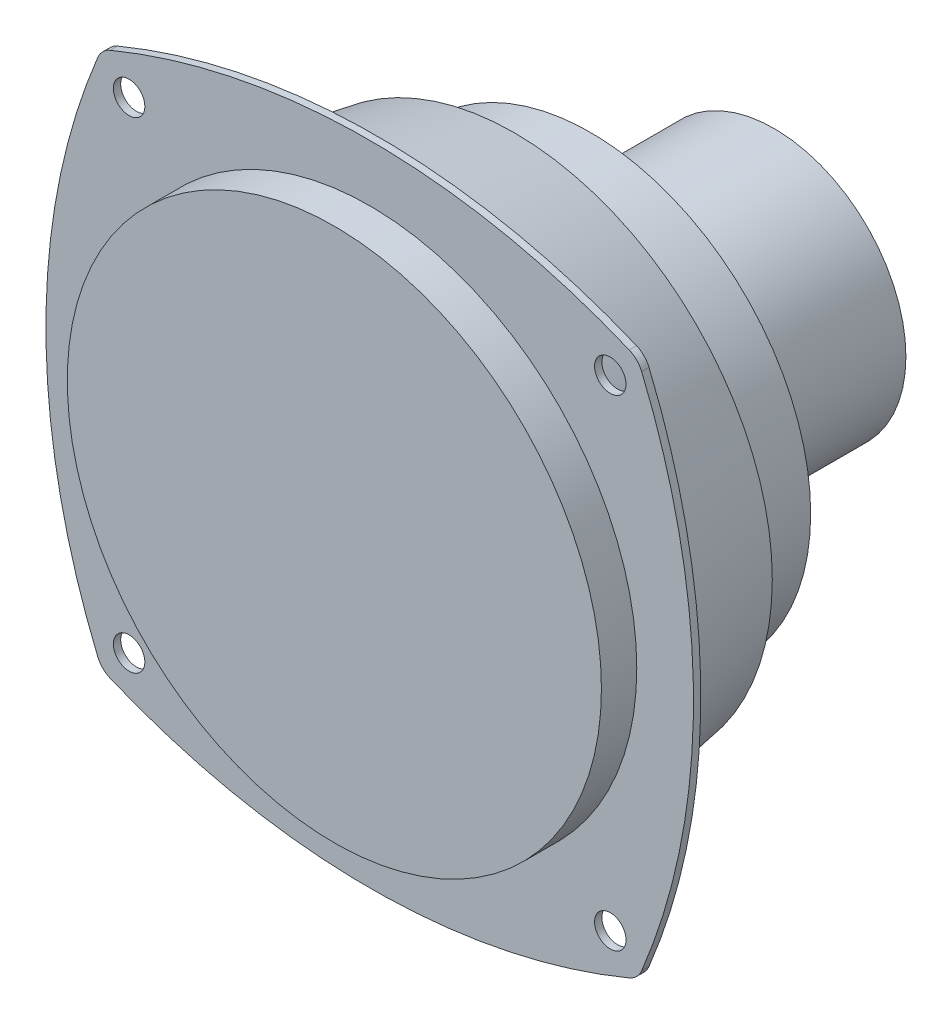
ISO-10303-21;
HEADER;
FILE_DESCRIPTION(('STEP AP214'),'2;1');
FILE_NAME('part.step','',(''),(''),'','','');
FILE_SCHEMA(('AUTOMOTIVE_DESIGN { 1 0 10303 214 1 1 1 1 }'));
ENDSEC;
DATA;
#1=APPLICATION_CONTEXT('core data for automotive mechanical design processes');
#2=APPLICATION_PROTOCOL_DEFINITION('international standard','automotive_design',2000,#1);
#3=PRODUCT_CONTEXT('',#1,'mechanical');
#4=PRODUCT('Part','Part','',(#3));
#5=PRODUCT_RELATED_PRODUCT_CATEGORY('part','',(#4));
#6=PRODUCT_DEFINITION_FORMATION('','',#4);
#7=PRODUCT_DEFINITION_CONTEXT('part definition',#1,'design');
#8=PRODUCT_DEFINITION('design','',#6,#7);
#9=PRODUCT_DEFINITION_SHAPE('','',#8);
#10=(LENGTH_UNIT() NAMED_UNIT(*) SI_UNIT(.MILLI.,.METRE.));
#11=(NAMED_UNIT(*) PLANE_ANGLE_UNIT() SI_UNIT($,.RADIAN.));
#12=(NAMED_UNIT(*) SI_UNIT($,.STERADIAN.) SOLID_ANGLE_UNIT());
#13=UNCERTAINTY_MEASURE_WITH_UNIT(LENGTH_MEASURE(1.E-05),#10,'distance_accuracy_value','');
#14=(GEOMETRIC_REPRESENTATION_CONTEXT(3) GLOBAL_UNCERTAINTY_ASSIGNED_CONTEXT((#13)) GLOBAL_UNIT_ASSIGNED_CONTEXT((#10,
#11,#12)) REPRESENTATION_CONTEXT('',''));
#15=CARTESIAN_POINT('',(0.,0.,0.));
#16=DIRECTION('',(0.,0.,1.));
#17=DIRECTION('',(1.,0.,0.));
#18=AXIS2_PLACEMENT_3D('',#15,#16,#17);
#19=CARTESIAN_POINT('',(0.,0.,-24.6));
#20=DIRECTION('',(0.,0.,1.));
#21=DIRECTION('',(1.,0.,0.));
#22=AXIS2_PLACEMENT_3D('',#19,#20,#21);
#23=CONICAL_SURFACE('',#22,35.25,0.168343554723202);
#24=CARTESIAN_POINT('',(0.,0.,-24.6));
#25=DIRECTION('',(0.,0.,1.));
#26=DIRECTION('',(1.,0.,0.));
#27=AXIS2_PLACEMENT_3D('',#24,#25,#26);
#28=CIRCLE('',#27,35.25);
#29=CARTESIAN_POINT('',(35.25,0.,-24.6));
#30=VERTEX_POINT('',#29);
#31=EDGE_CURVE('E289',#30,#30,#28,.T.);
#32=ORIENTED_EDGE('',*,*,#31,.T.);
#33=EDGE_LOOP('',(#32));
#34=FACE_BOUND('',#33,.T.);
#35=CARTESIAN_POINT('',(-15.5235468561056,-37.3499999999998,5.98235525157286));
#36=CARTESIAN_POINT('',(-15.2503462529446,-37.3499999999998,5.36558815334524));
#37=CARTESIAN_POINT('',(-14.972124426962,-37.3499999999998,4.75100106079624));
#38=CARTESIAN_POINT('',(-14.403805412816,-37.3499999999998,3.52709129327048));
#39=CARTESIAN_POINT('',(-14.1137041530564,-37.3499999999998,2.91777051142405));
#40=CARTESIAN_POINT('',(-13.516308900915,-37.3499999999998,1.69823177912345));
#41=CARTESIAN_POINT('',(-13.2088466674263,-37.3499999999998,1.08809590678744));
#42=CARTESIAN_POINT('',(-12.5777298922881,-37.3499999999998,-0.12365363799931));
#43=CARTESIAN_POINT('',(-12.2540777855418,-37.3499999999998,-0.725268574611103));
#44=CARTESIAN_POINT('',(-11.5721487939007,-37.3499999999998,-1.94529667180509));
#45=CARTESIAN_POINT('',(-11.2129634975808,-37.3499999999998,-2.56320536630982));
#46=CARTESIAN_POINT('',(-10.4688189886558,-37.3499999999998,-3.78373545523869));
#47=CARTESIAN_POINT('',(-10.0838491132485,-37.3499999999998,-4.38635038134488));
#48=CARTESIAN_POINT('',(-9.284148853347,-37.3499999999998,-5.56726897399857));
#49=CARTESIAN_POINT('',(-8.86958379500109,-37.3499999999998,-6.14568285089964));
#50=CARTESIAN_POINT('',(-8.21809589145369,-37.3499999999998,-6.99006991828984));
#51=CARTESIAN_POINT('',(-7.99608180825455,-37.3499999999998,-7.26756049878882));
#52=CARTESIAN_POINT('',(-7.54078221758439,-37.3499999999998,-7.81310433150241));
#53=CARTESIAN_POINT('',(-7.30749901257265,-37.3499999999998,-8.08115949233635));
#54=CARTESIAN_POINT('',(-6.88085209540887,-37.3499999999998,-8.54791475547698));
#55=CARTESIAN_POINT('',(-6.68999382384524,-37.3499999999998,-8.7489015625295));
#56=CARTESIAN_POINT('',(-6.29962537340333,-37.3499999999998,-9.14241648821872));
#57=CARTESIAN_POINT('',(-6.1001130189251,-37.3499999999998,-9.33494245505887));
#58=CARTESIAN_POINT('',(-5.69165163646688,-37.3499999999998,-9.70968434493123));
#59=CARTESIAN_POINT('',(-5.48270561895312,-37.3499999999998,-9.89190351582664));
#60=CARTESIAN_POINT('',(-5.05459925348257,-37.3499999999998,-10.2437578465474));
#61=CARTESIAN_POINT('',(-4.83543907617816,-37.3499999999998,-10.413393216493));
#62=CARTESIAN_POINT('',(-4.15338939096348,-37.3499999999998,-10.9050562948552));
#63=CARTESIAN_POINT('',(-3.67243927331983,-37.3499999999998,-11.2036329327324));
#64=CARTESIAN_POINT('',(-2.91651188014487,-37.3499999999998,-11.5794968545637));
#65=CARTESIAN_POINT('',(-2.6592396180917,-37.3499999999998,-11.6926566351789));
#66=CARTESIAN_POINT('',(-2.13406220631026,-37.3499999999998,-11.8905369980152));
#67=CARTESIAN_POINT('',(-1.8661653624615,-37.3499999999998,-11.9752793242347));
#68=CARTESIAN_POINT('',(-1.23772340576529,-37.3499999999998,-12.1328655366262));
#69=CARTESIAN_POINT('',(-0.874103489644981,-37.3499999999998,-12.1939640598733));
#70=CARTESIAN_POINT('',(-0.14168953552296,-37.3499999999998,-12.252547052158));
#71=CARTESIAN_POINT('',(0.227104235327452,-37.3499999999998,-12.250034793735));
#72=CARTESIAN_POINT('',(0.957963658914156,-37.3499999999998,-12.1818052793039));
#73=CARTESIAN_POINT('',(1.32004034124452,-37.3499999999998,-12.1162031352786));
#74=CARTESIAN_POINT('',(2.02923856635768,-37.3499999999998,-11.9293661259569));
#75=CARTESIAN_POINT('',(2.37635194312966,-37.3499999999998,-11.8081012936834));
#76=CARTESIAN_POINT('',(3.23170332980267,-37.3499999999998,-11.4434202815053));
#77=CARTESIAN_POINT('',(3.72682231815647,-37.3499999999998,-11.169361009193));
#78=CARTESIAN_POINT('',(4.43347693290436,-37.3499999999998,-10.7050565932076));
#79=CARTESIAN_POINT('',(4.66344971155165,-37.3499999999998,-10.5410360835303));
#80=CARTESIAN_POINT('',(5.11226981876912,-37.3499999999998,-10.1983419118858));
#81=CARTESIAN_POINT('',(5.33111870701025,-37.3499999999998,-10.0196703133661));
#82=CARTESIAN_POINT('',(5.80790496418261,-37.3499999999998,-9.6077211318686));
#83=CARTESIAN_POINT('',(6.06316904440405,-37.3499999999998,-9.37137481638139));
#84=CARTESIAN_POINT('',(6.55982768200348,-37.3499999999998,-8.88444925099785));
#85=CARTESIAN_POINT('',(6.80121703963284,-37.3499999999998,-8.63386473419568));
#86=CARTESIAN_POINT('',(7.27198134562937,-37.3499999999998,-8.12104313093173));
#87=CARTESIAN_POINT('',(7.50133839801556,-37.3499999999998,-7.85878970297194));
#88=CARTESIAN_POINT('',(7.94913436398128,-37.3499999999998,-7.3251110295253));
#89=CARTESIAN_POINT('',(8.16757204982306,-37.3499999999998,-7.05368475839885));
#90=CARTESIAN_POINT('',(8.59734115777907,-37.3499999999998,-6.50000869610199));
#91=CARTESIAN_POINT('',(8.80855467814404,-37.3499999999998,-6.21766770235995));
#92=CARTESIAN_POINT('',(9.22217660007314,-37.3499999999998,-5.64661709166166));
#93=CARTESIAN_POINT('',(9.42458478395215,-37.3499999999998,-5.35790731752234));
#94=CARTESIAN_POINT('',(9.82134145917095,-37.3499999999998,-4.77545013640787));
#95=CARTESIAN_POINT('',(10.0156980538797,-37.3499999999998,-4.48170823673739));
#96=CARTESIAN_POINT('',(10.3973718856423,-37.3499999999998,-3.88970989639038));
#97=CARTESIAN_POINT('',(10.5846892915042,-37.3499999999998,-3.59145356421608));
#98=CARTESIAN_POINT('',(11.1483451805988,-37.3499999999998,-2.67267946681172));
#99=CARTESIAN_POINT('',(11.5144513662635,-37.3499999999998,-2.04587135087793));
#100=CARTESIAN_POINT('',(12.224801821974,-37.3499999999998,-0.779936940443145));
#101=CARTESIAN_POINT('',(12.5690418187565,-37.3499999999998,-0.140808269779138));
#102=CARTESIAN_POINT('',(13.2394515720022,-37.3499999999998,1.14734669890425));
#103=CARTESIAN_POINT('',(13.5656096392183,-37.3499999999998,1.79637906142239));
#104=CARTESIAN_POINT('',(14.2024393823192,-37.3499999999998,3.10200415721866));
#105=CARTESIAN_POINT('',(14.5131103745399,-37.3499999999998,3.75859722268549));
#106=CARTESIAN_POINT('',(15.1223045392439,-37.3499999999998,5.08039897072367));
#107=CARTESIAN_POINT('',(15.4207771787562,-37.3499999999998,5.74563088269547));
#108=CARTESIAN_POINT('',(16.0060988155295,-37.3499999999998,7.08118872675436));
#109=CARTESIAN_POINT('',(16.2929476396943,-37.3499999999998,7.75151473452384));
#110=CARTESIAN_POINT('',(16.8563464767785,-37.3499999999998,9.09616873569007));
#111=CARTESIAN_POINT('',(17.1329004296426,-37.3499999999998,9.77049508115091));
#112=CARTESIAN_POINT('',(17.6770025470352,-37.3499999999998,11.1227753400679));
#113=CARTESIAN_POINT('',(17.9445505758563,-37.3499999999998,11.8007293080094));
#114=CARTESIAN_POINT('',(18.6797352513114,-37.3499999999998,13.6962790324301));
#115=CARTESIAN_POINT('',(19.1385559829667,-37.3499999999998,14.9172975045155));
#116=CARTESIAN_POINT('',(20.0350543171914,-37.3499999999998,17.3671812869839));
#117=CARTESIAN_POINT('',(20.4727296226317,-37.3499999999998,18.5960474335531));
#118=CARTESIAN_POINT('',(21.3267449263369,-37.3499999999998,21.0500007488422));
#119=CARTESIAN_POINT('',(21.7432290995711,-37.3499999999998,22.2750378165703));
#120=CARTESIAN_POINT('',(22.3566299003256,-37.3499999999998,24.1162213219027));
#121=CARTESIAN_POINT('',(22.5591908620544,-37.3499999999998,24.7304962498316));
#122=CARTESIAN_POINT('',(22.9608064764939,-37.3499999999998,25.9601860705966));
#123=CARTESIAN_POINT('',(23.1598611573671,-37.3499999999998,26.5756009542327));
#124=CARTESIAN_POINT('',(23.3572916756775,-37.3499999999998,27.1915372096555));
#125=B_SPLINE_CURVE_WITH_KNOTS('',3,(#35,#36,#37,#38,#39,#40,#41,#42,#43,#44,#45,#46,#47,#48,
#49,#50,#51,#52,#53,#54,#55,#56,#57,#58,#59,#60,#61,#62,#63,#64,#65,#66,#67,#68,#69,#70,#71,#72,
#73,#74,#75,#76,#77,#78,#79,#80,#81,#82,#83,#84,#85,#86,#87,#88,#89,#90,#91,#92,#93,#94,#95,#96,
#97,#98,#99,#100,#101,#102,#103,#104,#105,#106,#107,#108,#109,#110,#111,#112,#113,#114,#115,
#116,#117,#118,#119,#120,#121,#122,#123,#124),.UNSPECIFIED.,.F.,.F.,(4,2,2,2,2,2,2,2,2,2,2,2,2,
2,2,2,2,2,2,2,2,2,2,2,2,2,2,2,2,2,2,2,2,2,2,2,2,2,2,2,2,2,2,2,4),(0.,2.02373753890646,
4.04817460306917,6.09764534411171,8.14680877289671,10.2904548552482,12.4349929478268,
14.5683691587835,15.634259949395,16.6999338752917,17.531213542366,18.3627034147665,
19.1939297925279,20.0251422876061,21.7143939619996,22.5562393551849,23.3974391213381,
24.4982744975482,25.5990532399629,26.6978273362706,27.7971936717971,29.4845545708208,
30.3316429794413,31.1786122890519,32.2215687897329,33.2649136382959,34.3097686752665,
35.3547409292791,36.4123518235889,37.4699888492624,38.5265342086494,39.5830542146662,
41.7601187295818,43.9376074028994,46.1164877035862,48.2954641041051,50.4827033661722,
52.6699751875789,54.8564011282591,57.0428600007875,60.955729206456,64.8690225344548,
68.7505976186609,70.6910226276883,72.6314320440527),.UNSPECIFIED.);
#126=CARTESIAN_POINT('',(-9.08906485838968,-37.3499999999998,-5.83));
#127=VERTEX_POINT('',#126);
#128=CARTESIAN_POINT('',(9.08906485838968,-37.3499999999998,-5.83));
#129=VERTEX_POINT('',#128);
#130=EDGE_CURVE('E149',#127,#129,#125,.T.);
#131=ORIENTED_EDGE('',*,*,#130,.F.);
#132=CARTESIAN_POINT('',(0.,0.,-5.83));
#133=DIRECTION('',(0.,0.,1.));
#134=DIRECTION('',(1.,0.,0.));
#135=AXIS2_PLACEMENT_3D('',#132,#133,#134);
#136=CIRCLE('',#135,38.44);
#137=EDGE_CURVE('E292',#129,#127,#136,.T.);
#138=ORIENTED_EDGE('',*,*,#137,.F.);
#139=EDGE_LOOP('',(#131,#138));
#140=FACE_BOUND('',#139,.T.);
#141=ADVANCED_FACE('F32',(#34,#140),#23,.T.);
#142=CARTESIAN_POINT('',(0.,38.44,-5.83));
#143=DIRECTION('',(0.,0.,1.));
#144=DIRECTION('',(1.,0.,0.));
#145=AXIS2_PLACEMENT_3D('',#142,#143,#144);
#146=PLANE('',#145);
#147=CARTESIAN_POINT('',(-34.237226461577,34.2372264615774,-5.83));
#148=DIRECTION('',(0.,0.,1.));
#149=DIRECTION('',(1.,0.,0.));
#150=AXIS2_PLACEMENT_3D('',#147,#148,#149);
#151=CIRCLE('',#150,3.17499999999855);
#152=CARTESIAN_POINT('',(-37.1686586931178,35.4567878876131,-5.83));
#153=VERTEX_POINT('',#152);
#154=CARTESIAN_POINT('',(-35.4567878876127,37.1686586931182,-5.83));
#155=VERTEX_POINT('',#154);
#156=EDGE_CURVE('E251',#153,#155,#151,.F.);
#157=ORIENTED_EDGE('',*,*,#156,.T.);
#158=CARTESIAN_POINT('',(0.,-48.0580208505994,-5.83));
#159=DIRECTION('',(0.,0.,1.));
#160=DIRECTION('',(1.,0.,0.));
#161=AXIS2_PLACEMENT_3D('',#158,#159,#160);
#162=CIRCLE('',#161,92.3080208505994);
#163=CARTESIAN_POINT('',(35.4567878876127,37.1686586931182,-5.83));
#164=VERTEX_POINT('',#163);
#165=EDGE_CURVE('E346',#155,#164,#162,.F.);
#166=ORIENTED_EDGE('',*,*,#165,.T.);
#167=CARTESIAN_POINT('',(34.2372264615757,34.2372264615756,-5.83));
#168=DIRECTION('',(0.,0.,1.));
#169=DIRECTION('',(1.,0.,0.));
#170=AXIS2_PLACEMENT_3D('',#167,#168,#169);
#171=CIRCLE('',#170,3.17500000000068);
#172=CARTESIAN_POINT('',(37.1686586931183,35.4567878876126,-5.83));
#173=VERTEX_POINT('',#172);
#174=EDGE_CURVE('E348',#164,#173,#171,.F.);
#175=ORIENTED_EDGE('',*,*,#174,.T.);
#176=CARTESIAN_POINT('',(-48.0580208505994,1.60854789077695E-13,-5.83));
#177=DIRECTION('',(0.,0.,1.));
#178=DIRECTION('',(1.,0.,0.));
#179=AXIS2_PLACEMENT_3D('',#176,#177,#178);
#180=CIRCLE('',#179,92.3080208505994);
#181=CARTESIAN_POINT('',(37.1686586931181,-35.4567878876128,-5.83));
#182=VERTEX_POINT('',#181);
#183=EDGE_CURVE('E350',#173,#182,#180,.F.);
#184=ORIENTED_EDGE('',*,*,#183,.T.);
#185=CARTESIAN_POINT('',(34.2372264615757,-34.2372264615761,-5.83));
#186=DIRECTION('',(0.,0.,1.));
#187=DIRECTION('',(1.,0.,0.));
#188=AXIS2_PLACEMENT_3D('',#185,#186,#187);
#189=CIRCLE('',#188,3.17500000000034);
#190=CARTESIAN_POINT('',(35.4567878876124,-37.1686586931185,-5.83));
#191=VERTEX_POINT('',#190);
#192=EDGE_CURVE('E352',#182,#191,#189,.F.);
#193=ORIENTED_EDGE('',*,*,#192,.T.);
#194=CARTESIAN_POINT('',(3.28648472059297E-13,48.0580208505994,-5.83));
#195=DIRECTION('',(0.,0.,1.));
#196=DIRECTION('',(1.,0.,0.));
#197=AXIS2_PLACEMENT_3D('',#194,#195,#196);
#198=CIRCLE('',#197,92.3080208505994);
#199=CARTESIAN_POINT('',(-35.456787887613,-37.168658693118,-5.83));
#200=VERTEX_POINT('',#199);
#201=EDGE_CURVE('E355',#191,#200,#198,.F.);
#202=ORIENTED_EDGE('',*,*,#201,.T.);
#203=CARTESIAN_POINT('',(-34.2372264615768,-34.2372264615762,-5.83));
#204=DIRECTION('',(0.,0.,1.));
#205=DIRECTION('',(1.,0.,0.));
#206=AXIS2_PLACEMENT_3D('',#203,#204,#205);
#207=CIRCLE('',#206,3.17499999999957);
#208=CARTESIAN_POINT('',(-37.1686586931186,-35.4567878876123,-5.83));
#209=VERTEX_POINT('',#208);
#210=EDGE_CURVE('E326',#200,#209,#207,.F.);
#211=ORIENTED_EDGE('',*,*,#210,.T.);
#212=CARTESIAN_POINT('',(48.0580208505994,-4.96442155040899E-13,-5.83));
#213=DIRECTION('',(0.,0.,1.));
#214=DIRECTION('',(1.,0.,0.));
#215=AXIS2_PLACEMENT_3D('',#212,#213,#214);
#216=CIRCLE('',#215,92.3080208505994);
#217=EDGE_CURVE('E300',#209,#153,#216,.F.);
#218=ORIENTED_EDGE('',*,*,#217,.T.);
#219=EDGE_LOOP('',(#157,#166,#175,#184,#193,#202,#211,#218));
#220=FACE_BOUND('',#219,.T.);
#221=CARTESIAN_POINT('',(-32.8804653251745,-32.8804653251745,-5.83));
#222=DIRECTION('',(0.,0.,1.));
#223=DIRECTION('',(1.,0.,0.));
#224=AXIS2_PLACEMENT_3D('',#221,#222,#223);
#225=CIRCLE('',#224,2.14999999999999);
#226=CARTESIAN_POINT('',(-30.7304653251745,-32.8804653251745,-5.83));
#227=VERTEX_POINT('',#226);
#228=EDGE_CURVE('E256',#227,#227,#225,.T.);
#229=ORIENTED_EDGE('',*,*,#228,.T.);
#230=EDGE_LOOP('',(#229));
#231=FACE_BOUND('',#230,.T.);
#232=CARTESIAN_POINT('',(32.8804653251745,-32.8804653251745,-5.83));
#233=DIRECTION('',(0.,0.,1.));
#234=DIRECTION('',(1.,0.,0.));
#235=AXIS2_PLACEMENT_3D('',#232,#233,#234);
#236=CIRCLE('',#235,2.14999999999999);
#237=CARTESIAN_POINT('',(35.0304653251744,-32.8804653251745,-5.83));
#238=VERTEX_POINT('',#237);
#239=EDGE_CURVE('E260',#238,#238,#236,.T.);
#240=ORIENTED_EDGE('',*,*,#239,.T.);
#241=EDGE_LOOP('',(#240));
#242=FACE_BOUND('',#241,.T.);
#243=CARTESIAN_POINT('',(32.8804653251745,32.8804653251744,-5.83));
#244=DIRECTION('',(0.,0.,1.));
#245=DIRECTION('',(1.,0.,0.));
#246=AXIS2_PLACEMENT_3D('',#243,#244,#245);
#247=CIRCLE('',#246,2.14999999999999);
#248=CARTESIAN_POINT('',(35.0304653251745,32.8804653251744,-5.83));
#249=VERTEX_POINT('',#248);
#250=EDGE_CURVE('E264',#249,#249,#247,.T.);
#251=ORIENTED_EDGE('',*,*,#250,.T.);
#252=EDGE_LOOP('',(#251));
#253=FACE_BOUND('',#252,.T.);
#254=CARTESIAN_POINT('',(-32.8804653251745,32.8804653251744,-5.83));
#255=DIRECTION('',(0.,0.,1.));
#256=DIRECTION('',(1.,0.,0.));
#257=AXIS2_PLACEMENT_3D('',#254,#255,#256);
#258=CIRCLE('',#257,2.14999999999999);
#259=CARTESIAN_POINT('',(-30.7304653251745,32.8804653251744,-5.83));
#260=VERTEX_POINT('',#259);
#261=EDGE_CURVE('E267',#260,#260,#258,.T.);
#262=ORIENTED_EDGE('',*,*,#261,.T.);
#263=EDGE_LOOP('',(#262));
#264=FACE_BOUND('',#263,.T.);
#265=DIRECTION('',(1.,0.,0.));
#266=VECTOR('',#265,1.);
#267=CARTESIAN_POINT('',(14.085,-37.3499999999998,-5.83));
#268=LINE('',#267,#266);
#269=CARTESIAN_POINT('',(-14.085,-37.3499999999998,-5.83));
#270=VERTEX_POINT('',#269);
#271=EDGE_CURVE('E47',#270,#127,#268,.T.);
#272=ORIENTED_EDGE('',*,*,#271,.F.);
#273=DIRECTION('',(0.,1.,0.));
#274=VECTOR('',#273,1.);
#275=CARTESIAN_POINT('',(-14.085,-37.3499999999998,-5.83));
#276=LINE('',#275,#274);
#277=CARTESIAN_POINT('',(-14.085,-39.85,-5.83));
#278=VERTEX_POINT('',#277);
#279=EDGE_CURVE('E51',#278,#270,#276,.T.);
#280=ORIENTED_EDGE('',*,*,#279,.F.);
#281=DIRECTION('',(-1.,0.,0.));
#282=VECTOR('',#281,1.);
#283=CARTESIAN_POINT('',(14.085,-39.8499999999997,-5.83));
#284=LINE('',#283,#282);
#285=CARTESIAN_POINT('',(14.085,-39.8499999999997,-5.83));
#286=VERTEX_POINT('',#285);
#287=EDGE_CURVE('E398',#286,#278,#284,.T.);
#288=ORIENTED_EDGE('',*,*,#287,.F.);
#289=DIRECTION('',(0.,-1.,0.));
#290=VECTOR('',#289,1.);
#291=CARTESIAN_POINT('',(14.085,-37.3499999999998,-5.83));
#292=LINE('',#291,#290);
#293=CARTESIAN_POINT('',(14.085,-37.3499999999998,-5.83));
#294=VERTEX_POINT('',#293);
#295=EDGE_CURVE('E148',#294,#286,#292,.T.);
#296=ORIENTED_EDGE('',*,*,#295,.F.);
#297=DIRECTION('',(1.,0.,0.));
#298=VECTOR('',#297,1.);
#299=CARTESIAN_POINT('',(0.,-37.3499999999998,-5.83));
#300=LINE('',#299,#298);
#301=EDGE_CURVE('E11',#129,#294,#300,.T.);
#302=ORIENTED_EDGE('',*,*,#301,.F.);
#303=ORIENTED_EDGE('',*,*,#137,.T.);
#304=EDGE_LOOP('',(#272,#280,#288,#296,#302,#303));
#305=FACE_BOUND('',#304,.T.);
#306=ADVANCED_FACE('F240',(#220,#231,#242,#253,#264,#305),#146,.F.);
#307=CARTESIAN_POINT('',(0.,44.25,-4.83));
#308=DIRECTION('',(0.,0.,-1.));
#309=DIRECTION('',(-1.,0.,0.));
#310=AXIS2_PLACEMENT_3D('',#307,#308,#309);
#311=PLANE('',#310);
#312=CARTESIAN_POINT('',(-32.8804653251745,32.8804653251744,-4.83));
#313=DIRECTION('',(0.,0.,1.));
#314=DIRECTION('',(1.,0.,0.));
#315=AXIS2_PLACEMENT_3D('',#312,#313,#314);
#316=CIRCLE('',#315,2.14999999999999);
#317=CARTESIAN_POINT('',(-30.7304653251745,32.8804653251744,-4.83));
#318=VERTEX_POINT('',#317);
#319=EDGE_CURVE('E152',#318,#318,#316,.T.);
#320=ORIENTED_EDGE('',*,*,#319,.F.);
#321=EDGE_LOOP('',(#320));
#322=FACE_BOUND('',#321,.T.);
#323=CARTESIAN_POINT('',(32.8804653251745,-32.8804653251745,-4.83));
#324=DIRECTION('',(0.,0.,1.));
#325=DIRECTION('',(1.,0.,0.));
#326=AXIS2_PLACEMENT_3D('',#323,#324,#325);
#327=CIRCLE('',#326,2.14999999999999);
#328=CARTESIAN_POINT('',(35.0304653251744,-32.8804653251745,-4.83));
#329=VERTEX_POINT('',#328);
#330=EDGE_CURVE('E274',#329,#329,#327,.T.);
#331=ORIENTED_EDGE('',*,*,#330,.F.);
#332=EDGE_LOOP('',(#331));
#333=FACE_BOUND('',#332,.T.);
#334=CARTESIAN_POINT('',(-32.8804653251745,-32.8804653251745,-4.83));
#335=DIRECTION('',(0.,0.,1.));
#336=DIRECTION('',(1.,0.,0.));
#337=AXIS2_PLACEMENT_3D('',#334,#335,#336);
#338=CIRCLE('',#337,2.14999999999999);
#339=CARTESIAN_POINT('',(-30.7304653251745,-32.8804653251745,-4.83));
#340=VERTEX_POINT('',#339);
#341=EDGE_CURVE('E277',#340,#340,#338,.T.);
#342=ORIENTED_EDGE('',*,*,#341,.F.);
#343=EDGE_LOOP('',(#342));
#344=FACE_BOUND('',#343,.T.);
#345=CARTESIAN_POINT('',(0.,0.,-4.83));
#346=DIRECTION('',(0.,0.,1.));
#347=DIRECTION('',(1.,0.,0.));
#348=AXIS2_PLACEMENT_3D('',#345,#346,#347);
#349=CIRCLE('',#348,36.5);
#350=CARTESIAN_POINT('',(36.5,0.,-4.83));
#351=VERTEX_POINT('',#350);
#352=EDGE_CURVE('E294',#351,#351,#349,.T.);
#353=ORIENTED_EDGE('',*,*,#352,.F.);
#354=EDGE_LOOP('',(#353));
#355=FACE_BOUND('',#354,.T.);
#356=CARTESIAN_POINT('',(34.2372264615757,-34.2372264615761,-4.83));
#357=DIRECTION('',(0.,0.,1.));
#358=DIRECTION('',(1.,0.,0.));
#359=AXIS2_PLACEMENT_3D('',#356,#357,#358);
#360=CIRCLE('',#359,3.17500000000034);
#361=CARTESIAN_POINT('',(35.4567878876124,-37.1686586931185,-4.83));
#362=VERTEX_POINT('',#361);
#363=CARTESIAN_POINT('',(37.1686586931181,-35.4567878876128,-4.83));
#364=VERTEX_POINT('',#363);
#365=EDGE_CURVE('E333',#362,#364,#360,.T.);
#366=ORIENTED_EDGE('',*,*,#365,.T.);
#367=CARTESIAN_POINT('',(-48.0580208505994,1.60854789077695E-13,-4.83));
#368=DIRECTION('',(0.,0.,1.));
#369=DIRECTION('',(-1.,0.,0.));
#370=AXIS2_PLACEMENT_3D('',#367,#368,#369);
#371=CIRCLE('',#370,92.3080208505994);
#372=CARTESIAN_POINT('',(37.1686586931183,35.4567878876126,-4.83));
#373=VERTEX_POINT('',#372);
#374=EDGE_CURVE('E331',#364,#373,#371,.T.);
#375=ORIENTED_EDGE('',*,*,#374,.T.);
#376=CARTESIAN_POINT('',(34.2372264615757,34.2372264615756,-4.83));
#377=DIRECTION('',(0.,0.,1.));
#378=DIRECTION('',(-1.,0.,0.));
#379=AXIS2_PLACEMENT_3D('',#376,#377,#378);
#380=CIRCLE('',#379,3.17500000000068);
#381=CARTESIAN_POINT('',(35.4567878876127,37.1686586931182,-4.83));
#382=VERTEX_POINT('',#381);
#383=EDGE_CURVE('E328',#373,#382,#380,.T.);
#384=ORIENTED_EDGE('',*,*,#383,.T.);
#385=CARTESIAN_POINT('',(0.,-48.0580208505994,-4.83));
#386=DIRECTION('',(0.,0.,1.));
#387=DIRECTION('',(-1.,0.,0.));
#388=AXIS2_PLACEMENT_3D('',#385,#386,#387);
#389=CIRCLE('',#388,92.3080208505994);
#390=CARTESIAN_POINT('',(-35.4567878876127,37.1686586931182,-4.83));
#391=VERTEX_POINT('',#390);
#392=EDGE_CURVE('E305',#382,#391,#389,.T.);
#393=ORIENTED_EDGE('',*,*,#392,.T.);
#394=CARTESIAN_POINT('',(-34.237226461577,34.2372264615774,-4.83));
#395=DIRECTION('',(0.,0.,1.));
#396=DIRECTION('',(-1.,0.,0.));
#397=AXIS2_PLACEMENT_3D('',#394,#395,#396);
#398=CIRCLE('',#397,3.17499999999855);
#399=CARTESIAN_POINT('',(-37.1686586931178,35.4567878876131,-4.83));
#400=VERTEX_POINT('',#399);
#401=EDGE_CURVE('E276',#391,#400,#398,.T.);
#402=ORIENTED_EDGE('',*,*,#401,.T.);
#403=CARTESIAN_POINT('',(48.0580208505994,-4.96442155040899E-13,-4.83));
#404=DIRECTION('',(0.,0.,1.));
#405=DIRECTION('',(-1.,0.,0.));
#406=AXIS2_PLACEMENT_3D('',#403,#404,#405);
#407=CIRCLE('',#406,92.3080208505994);
#408=CARTESIAN_POINT('',(-37.1686586931186,-35.4567878876123,-4.83));
#409=VERTEX_POINT('',#408);
#410=EDGE_CURVE('E341',#400,#409,#407,.T.);
#411=ORIENTED_EDGE('',*,*,#410,.T.);
#412=CARTESIAN_POINT('',(-34.2372264615768,-34.2372264615762,-4.83));
#413=DIRECTION('',(0.,0.,1.));
#414=DIRECTION('',(1.,0.,0.));
#415=AXIS2_PLACEMENT_3D('',#412,#413,#414);
#416=CIRCLE('',#415,3.17499999999957);
#417=CARTESIAN_POINT('',(-35.456787887613,-37.168658693118,-4.83));
#418=VERTEX_POINT('',#417);
#419=EDGE_CURVE('E338',#409,#418,#416,.T.);
#420=ORIENTED_EDGE('',*,*,#419,.T.);
#421=CARTESIAN_POINT('',(3.28648472059297E-13,48.0580208505994,-4.83));
#422=DIRECTION('',(0.,0.,1.));
#423=DIRECTION('',(-1.,0.,0.));
#424=AXIS2_PLACEMENT_3D('',#421,#422,#423);
#425=CIRCLE('',#424,92.3080208505994);
#426=EDGE_CURVE('E336',#418,#362,#425,.T.);
#427=ORIENTED_EDGE('',*,*,#426,.T.);
#428=EDGE_LOOP('',(#366,#375,#384,#393,#402,#411,#420,#427));
#429=FACE_BOUND('',#428,.T.);
#430=CARTESIAN_POINT('',(32.8804653251745,32.8804653251744,-4.83));
#431=DIRECTION('',(0.,0.,1.));
#432=DIRECTION('',(1.,0.,0.));
#433=AXIS2_PLACEMENT_3D('',#430,#431,#432);
#434=CIRCLE('',#433,2.14999999999999);
#435=CARTESIAN_POINT('',(35.0304653251745,32.8804653251744,-4.83));
#436=VERTEX_POINT('',#435);
#437=EDGE_CURVE('E269',#436,#436,#434,.T.);
#438=ORIENTED_EDGE('',*,*,#437,.F.);
#439=EDGE_LOOP('',(#438));
#440=FACE_BOUND('',#439,.T.);
#441=ADVANCED_FACE('F238',(#322,#333,#344,#355,#429,#440),#311,.F.);
#442=CARTESIAN_POINT('',(0.,0.,-60.11));
#443=DIRECTION('',(0.,0.,1.));
#444=DIRECTION('',(1.,0.,0.));
#445=AXIS2_PLACEMENT_3D('',#442,#443,#444);
#446=PLANE('',#445);
#447=CARTESIAN_POINT('',(0.,0.,-60.11));
#448=DIRECTION('',(0.,0.,1.));
#449=DIRECTION('',(1.,0.,0.));
#450=AXIS2_PLACEMENT_3D('',#447,#448,#449);
#451=CIRCLE('',#450,18.);
#452=CARTESIAN_POINT('',(18.,0.,-60.11));
#453=VERTEX_POINT('',#452);
#454=EDGE_CURVE('E40',#453,#453,#451,.T.);
#455=ORIENTED_EDGE('',*,*,#454,.F.);
#456=EDGE_LOOP('',(#455));
#457=FACE_BOUND('',#456,.T.);
#458=ADVANCED_FACE('F34',(#457),#446,.F.);
#459=CARTESIAN_POINT('',(0.,0.,0.));
#460=DIRECTION('',(0.,0.,1.));
#461=DIRECTION('',(1.,0.,0.));
#462=AXIS2_PLACEMENT_3D('',#459,#460,#461);
#463=CYLINDRICAL_SURFACE('',#462,18.);
#464=CARTESIAN_POINT('',(0.,0.,-35.01));
#465=DIRECTION('',(0.,0.,1.));
#466=DIRECTION('',(1.,0.,0.));
#467=AXIS2_PLACEMENT_3D('',#464,#465,#466);
#468=CIRCLE('',#467,18.);
#469=CARTESIAN_POINT('',(18.,0.,-35.01));
#470=VERTEX_POINT('',#469);
#471=EDGE_CURVE('E280',#470,#470,#468,.T.);
#472=ORIENTED_EDGE('',*,*,#471,.F.);
#473=EDGE_LOOP('',(#472));
#474=FACE_BOUND('',#473,.T.);
#475=ORIENTED_EDGE('',*,*,#454,.T.);
#476=EDGE_LOOP('',(#475));
#477=FACE_BOUND('',#476,.T.);
#478=ADVANCED_FACE('F421',(#474,#477),#463,.T.);
#479=CARTESIAN_POINT('',(0.,18.,-35.01));
#480=DIRECTION('',(0.,0.,1.));
#481=DIRECTION('',(1.,0.,0.));
#482=AXIS2_PLACEMENT_3D('',#479,#480,#481);
#483=PLANE('',#482);
#484=CARTESIAN_POINT('',(0.,0.,-35.01));
#485=DIRECTION('',(0.,0.,1.));
#486=DIRECTION('',(1.,0.,0.));
#487=AXIS2_PLACEMENT_3D('',#484,#485,#486);
#488=CIRCLE('',#487,30.085);
#489=CARTESIAN_POINT('',(30.085,0.,-35.01));
#490=VERTEX_POINT('',#489);
#491=EDGE_CURVE('E283',#490,#490,#488,.T.);
#492=ORIENTED_EDGE('',*,*,#491,.F.);
#493=EDGE_LOOP('',(#492));
#494=FACE_BOUND('',#493,.T.);
#495=ORIENTED_EDGE('',*,*,#471,.T.);
#496=EDGE_LOOP('',(#495));
#497=FACE_BOUND('',#496,.T.);
#498=ADVANCED_FACE('F415',(#494,#497),#483,.F.);
#499=CARTESIAN_POINT('',(0.,0.,0.));
#500=DIRECTION('',(0.,0.,1.));
#501=DIRECTION('',(1.,0.,0.));
#502=AXIS2_PLACEMENT_3D('',#499,#500,#501);
#503=CYLINDRICAL_SURFACE('',#502,30.085);
#504=CARTESIAN_POINT('',(0.,0.,-24.6));
#505=DIRECTION('',(0.,0.,1.));
#506=DIRECTION('',(1.,0.,0.));
#507=AXIS2_PLACEMENT_3D('',#504,#505,#506);
#508=CIRCLE('',#507,30.085);
#509=CARTESIAN_POINT('',(30.085,0.,-24.6));
#510=VERTEX_POINT('',#509);
#511=EDGE_CURVE('E286',#510,#510,#508,.T.);
#512=ORIENTED_EDGE('',*,*,#511,.F.);
#513=EDGE_LOOP('',(#512));
#514=FACE_BOUND('',#513,.T.);
#515=ORIENTED_EDGE('',*,*,#491,.T.);
#516=EDGE_LOOP('',(#515));
#517=FACE_BOUND('',#516,.T.);
#518=ADVANCED_FACE('F410',(#514,#517),#503,.T.);
#519=CARTESIAN_POINT('',(0.,30.085,-24.6));
#520=DIRECTION('',(0.,0.,1.));
#521=DIRECTION('',(1.,0.,0.));
#522=AXIS2_PLACEMENT_3D('',#519,#520,#521);
#523=PLANE('',#522);
#524=ORIENTED_EDGE('',*,*,#31,.F.);
#525=EDGE_LOOP('',(#524));
#526=FACE_BOUND('',#525,.T.);
#527=ORIENTED_EDGE('',*,*,#511,.T.);
#528=EDGE_LOOP('',(#527));
#529=FACE_BOUND('',#528,.T.);
#530=ADVANCED_FACE('F202',(#526,#529),#523,.F.);
#531=CARTESIAN_POINT('',(0.,-48.0580208505994,-130.987900270019));
#532=DIRECTION('',(0.,0.,1.));
#533=DIRECTION('',(1.,0.,0.));
#534=AXIS2_PLACEMENT_3D('',#531,#532,#533);
#535=CYLINDRICAL_SURFACE('',#534,92.3080208505994);
#536=ORIENTED_EDGE('',*,*,#392,.F.);
#537=DIRECTION('',(0.,0.,1.));
#538=VECTOR('',#537,1.);
#539=CARTESIAN_POINT('',(35.4567878876127,37.1686586931182,-130.987900270019));
#540=LINE('',#539,#538);
#541=EDGE_CURVE('E320',#164,#382,#540,.T.);
#542=ORIENTED_EDGE('',*,*,#541,.F.);
#543=ORIENTED_EDGE('',*,*,#165,.F.);
#544=DIRECTION('',(0.,0.,1.));
#545=VECTOR('',#544,1.);
#546=CARTESIAN_POINT('',(-35.4567878876127,37.1686586931182,-130.987900270019));
#547=LINE('',#546,#545);
#548=EDGE_CURVE('E323',#155,#391,#547,.T.);
#549=ORIENTED_EDGE('',*,*,#548,.T.);
#550=EDGE_LOOP('',(#536,#542,#543,#549));
#551=FACE_BOUND('',#550,.T.);
#552=ADVANCED_FACE('F198',(#551),#535,.T.);
#553=CARTESIAN_POINT('',(-48.0580208505994,1.60854789077695E-13,-130.987900270019));
#554=DIRECTION('',(0.,0.,1.));
#555=DIRECTION('',(1.,0.,0.));
#556=AXIS2_PLACEMENT_3D('',#553,#554,#555);
#557=CYLINDRICAL_SURFACE('',#556,92.3080208505994);
#558=ORIENTED_EDGE('',*,*,#374,.F.);
#559=DIRECTION('',(0.,0.,1.));
#560=VECTOR('',#559,1.);
#561=CARTESIAN_POINT('',(37.1686586931181,-35.4567878876128,-130.987900270019));
#562=LINE('',#561,#560);
#563=EDGE_CURVE('E314',#182,#364,#562,.T.);
#564=ORIENTED_EDGE('',*,*,#563,.F.);
#565=ORIENTED_EDGE('',*,*,#183,.F.);
#566=DIRECTION('',(0.,0.,1.));
#567=VECTOR('',#566,1.);
#568=CARTESIAN_POINT('',(37.1686586931183,35.4567878876126,-130.987900270019));
#569=LINE('',#568,#567);
#570=EDGE_CURVE('E317',#173,#373,#569,.T.);
#571=ORIENTED_EDGE('',*,*,#570,.T.);
#572=EDGE_LOOP('',(#558,#564,#565,#571));
#573=FACE_BOUND('',#572,.T.);
#574=ADVANCED_FACE('F201',(#573),#557,.T.);
#575=CARTESIAN_POINT('',(3.28648472059297E-13,48.0580208505994,-130.987900270019));
#576=DIRECTION('',(0.,0.,1.));
#577=DIRECTION('',(1.,0.,0.));
#578=AXIS2_PLACEMENT_3D('',#575,#576,#577);
#579=CYLINDRICAL_SURFACE('',#578,92.3080208505994);
#580=ORIENTED_EDGE('',*,*,#426,.F.);
#581=DIRECTION('',(0.,0.,1.));
#582=VECTOR('',#581,1.);
#583=CARTESIAN_POINT('',(-35.456787887613,-37.168658693118,-130.987900270019));
#584=LINE('',#583,#582);
#585=EDGE_CURVE('E308',#200,#418,#584,.T.);
#586=ORIENTED_EDGE('',*,*,#585,.F.);
#587=ORIENTED_EDGE('',*,*,#201,.F.);
#588=DIRECTION('',(0.,0.,1.));
#589=VECTOR('',#588,1.);
#590=CARTESIAN_POINT('',(35.4567878876124,-37.1686586931185,-130.987900270019));
#591=LINE('',#590,#589);
#592=EDGE_CURVE('E311',#191,#362,#591,.T.);
#593=ORIENTED_EDGE('',*,*,#592,.T.);
#594=EDGE_LOOP('',(#580,#586,#587,#593));
#595=FACE_BOUND('',#594,.T.);
#596=ADVANCED_FACE('F212',(#595),#579,.T.);
#597=CARTESIAN_POINT('',(48.0580208505994,-4.96442155040899E-13,-130.987900270019));
#598=DIRECTION('',(0.,0.,1.));
#599=DIRECTION('',(1.,0.,0.));
#600=AXIS2_PLACEMENT_3D('',#597,#598,#599);
#601=CYLINDRICAL_SURFACE('',#600,92.3080208505994);
#602=DIRECTION('',(0.,0.,1.));
#603=VECTOR('',#602,1.);
#604=CARTESIAN_POINT('',(-37.1686586931186,-35.4567878876123,-130.987900270019));
#605=LINE('',#604,#603);
#606=EDGE_CURVE('E304',#209,#409,#605,.T.);
#607=ORIENTED_EDGE('',*,*,#606,.T.);
#608=ORIENTED_EDGE('',*,*,#410,.F.);
#609=DIRECTION('',(0.,0.,1.));
#610=VECTOR('',#609,1.);
#611=CARTESIAN_POINT('',(-37.1686586931178,35.4567878876131,-130.987900270019));
#612=LINE('',#611,#610);
#613=EDGE_CURVE('E302',#153,#400,#612,.T.);
#614=ORIENTED_EDGE('',*,*,#613,.F.);
#615=ORIENTED_EDGE('',*,*,#217,.F.);
#616=EDGE_LOOP('',(#607,#608,#614,#615));
#617=FACE_BOUND('',#616,.T.);
#618=ADVANCED_FACE('F220',(#617),#601,.T.);
#619=CARTESIAN_POINT('',(-34.237226461577,34.2372264615774,-130.987900270019));
#620=DIRECTION('',(0.,0.,1.));
#621=DIRECTION('',(1.,0.,0.));
#622=AXIS2_PLACEMENT_3D('',#619,#620,#621);
#623=CYLINDRICAL_SURFACE('',#622,3.17499999999855);
#624=ORIENTED_EDGE('',*,*,#156,.F.);
#625=ORIENTED_EDGE('',*,*,#613,.T.);
#626=ORIENTED_EDGE('',*,*,#401,.F.);
#627=ORIENTED_EDGE('',*,*,#548,.F.);
#628=EDGE_LOOP('',(#624,#625,#626,#627));
#629=FACE_BOUND('',#628,.T.);
#630=ADVANCED_FACE('F208',(#629),#623,.T.);
#631=CARTESIAN_POINT('',(34.2372264615757,34.2372264615756,-130.987900270019));
#632=DIRECTION('',(0.,0.,1.));
#633=DIRECTION('',(1.,0.,0.));
#634=AXIS2_PLACEMENT_3D('',#631,#632,#633);
#635=CYLINDRICAL_SURFACE('',#634,3.17500000000068);
#636=ORIENTED_EDGE('',*,*,#174,.F.);
#637=ORIENTED_EDGE('',*,*,#541,.T.);
#638=ORIENTED_EDGE('',*,*,#383,.F.);
#639=ORIENTED_EDGE('',*,*,#570,.F.);
#640=EDGE_LOOP('',(#636,#637,#638,#639));
#641=FACE_BOUND('',#640,.T.);
#642=ADVANCED_FACE('F204',(#641),#635,.T.);
#643=CARTESIAN_POINT('',(34.2372264615757,-34.2372264615761,-130.987900270019));
#644=DIRECTION('',(0.,0.,1.));
#645=DIRECTION('',(1.,0.,0.));
#646=AXIS2_PLACEMENT_3D('',#643,#644,#645);
#647=CYLINDRICAL_SURFACE('',#646,3.17500000000034);
#648=ORIENTED_EDGE('',*,*,#192,.F.);
#649=ORIENTED_EDGE('',*,*,#563,.T.);
#650=ORIENTED_EDGE('',*,*,#365,.F.);
#651=ORIENTED_EDGE('',*,*,#592,.F.);
#652=EDGE_LOOP('',(#648,#649,#650,#651));
#653=FACE_BOUND('',#652,.T.);
#654=ADVANCED_FACE('F207',(#653),#647,.T.);
#655=CARTESIAN_POINT('',(-34.2372264615768,-34.2372264615762,-130.987900270019));
#656=DIRECTION('',(0.,0.,1.));
#657=DIRECTION('',(1.,0.,0.));
#658=AXIS2_PLACEMENT_3D('',#655,#656,#657);
#659=CYLINDRICAL_SURFACE('',#658,3.17499999999957);
#660=ORIENTED_EDGE('',*,*,#210,.F.);
#661=ORIENTED_EDGE('',*,*,#585,.T.);
#662=ORIENTED_EDGE('',*,*,#419,.F.);
#663=ORIENTED_EDGE('',*,*,#606,.F.);
#664=EDGE_LOOP('',(#660,#661,#662,#663));
#665=FACE_BOUND('',#664,.T.);
#666=ADVANCED_FACE('F216',(#665),#659,.T.);
#667=CARTESIAN_POINT('',(0.,36.5,0.));
#668=DIRECTION('',(0.,0.,-1.));
#669=DIRECTION('',(-1.,0.,0.));
#670=AXIS2_PLACEMENT_3D('',#667,#668,#669);
#671=PLANE('',#670);
#672=CARTESIAN_POINT('',(0.,0.,0.));
#673=DIRECTION('',(0.,0.,1.));
#674=DIRECTION('',(1.,0.,0.));
#675=AXIS2_PLACEMENT_3D('',#672,#673,#674);
#676=CIRCLE('',#675,36.5);
#677=CARTESIAN_POINT('',(36.5,0.,0.));
#678=VERTEX_POINT('',#677);
#679=EDGE_CURVE('E297',#678,#678,#676,.T.);
#680=ORIENTED_EDGE('',*,*,#679,.T.);
#681=EDGE_LOOP('',(#680));
#682=FACE_BOUND('',#681,.T.);
#683=ADVANCED_FACE('F224',(#682),#671,.F.);
#684=CARTESIAN_POINT('',(0.,0.,0.));
#685=DIRECTION('',(0.,0.,1.));
#686=DIRECTION('',(1.,0.,0.));
#687=AXIS2_PLACEMENT_3D('',#684,#685,#686);
#688=CYLINDRICAL_SURFACE('',#687,36.5);
#689=ORIENTED_EDGE('',*,*,#679,.F.);
#690=EDGE_LOOP('',(#689));
#691=FACE_BOUND('',#690,.T.);
#692=ORIENTED_EDGE('',*,*,#352,.T.);
#693=EDGE_LOOP('',(#692));
#694=FACE_BOUND('',#693,.T.);
#695=ADVANCED_FACE('F196',(#691,#694),#688,.T.);
#696=CARTESIAN_POINT('',(-32.8804653251745,-32.8804653251745,-4.83));
#697=DIRECTION('',(0.,0.,1.));
#698=DIRECTION('',(1.,0.,0.));
#699=AXIS2_PLACEMENT_3D('',#696,#697,#698);
#700=CYLINDRICAL_SURFACE('',#699,2.14999999999999);
#701=ORIENTED_EDGE('',*,*,#341,.T.);
#702=EDGE_LOOP('',(#701));
#703=FACE_BOUND('',#702,.T.);
#704=ORIENTED_EDGE('',*,*,#228,.F.);
#705=EDGE_LOOP('',(#704));
#706=FACE_BOUND('',#705,.T.);
#707=ADVANCED_FACE('F192',(#703,#706),#700,.F.);
#708=CARTESIAN_POINT('',(32.8804653251745,-32.8804653251745,-4.83));
#709=DIRECTION('',(0.,0.,1.));
#710=DIRECTION('',(1.,0.,0.));
#711=AXIS2_PLACEMENT_3D('',#708,#709,#710);
#712=CYLINDRICAL_SURFACE('',#711,2.14999999999999);
#713=ORIENTED_EDGE('',*,*,#330,.T.);
#714=EDGE_LOOP('',(#713));
#715=FACE_BOUND('',#714,.T.);
#716=ORIENTED_EDGE('',*,*,#239,.F.);
#717=EDGE_LOOP('',(#716));
#718=FACE_BOUND('',#717,.T.);
#719=ADVANCED_FACE('F188',(#715,#718),#712,.F.);
#720=CARTESIAN_POINT('',(32.8804653251745,32.8804653251744,-4.83));
#721=DIRECTION('',(0.,0.,1.));
#722=DIRECTION('',(1.,0.,0.));
#723=AXIS2_PLACEMENT_3D('',#720,#721,#722);
#724=CYLINDRICAL_SURFACE('',#723,2.14999999999999);
#725=ORIENTED_EDGE('',*,*,#437,.T.);
#726=EDGE_LOOP('',(#725));
#727=FACE_BOUND('',#726,.T.);
#728=ORIENTED_EDGE('',*,*,#250,.F.);
#729=EDGE_LOOP('',(#728));
#730=FACE_BOUND('',#729,.T.);
#731=ADVANCED_FACE('F184',(#727,#730),#724,.F.);
#732=CARTESIAN_POINT('',(-32.8804653251745,32.8804653251744,-4.83));
#733=DIRECTION('',(0.,0.,1.));
#734=DIRECTION('',(1.,0.,0.));
#735=AXIS2_PLACEMENT_3D('',#732,#733,#734);
#736=CYLINDRICAL_SURFACE('',#735,2.14999999999999);
#737=ORIENTED_EDGE('',*,*,#319,.T.);
#738=EDGE_LOOP('',(#737));
#739=FACE_BOUND('',#738,.T.);
#740=ORIENTED_EDGE('',*,*,#261,.F.);
#741=EDGE_LOOP('',(#740));
#742=FACE_BOUND('',#741,.T.);
#743=ADVANCED_FACE('F172',(#739,#742),#736,.F.);
#744=CARTESIAN_POINT('',(14.085,-37.3499999999998,-29.36));
#745=DIRECTION('',(0.,-1.,0.));
#746=DIRECTION('',(0.,0.,-1.));
#747=AXIS2_PLACEMENT_3D('',#744,#745,#746);
#748=PLANE('',#747);
#749=ORIENTED_EDGE('',*,*,#271,.T.);
#750=ORIENTED_EDGE('',*,*,#130,.T.);
#751=ORIENTED_EDGE('',*,*,#301,.T.);
#752=DIRECTION('',(0.,0.,1.));
#753=VECTOR('',#752,1.);
#754=CARTESIAN_POINT('',(14.085,-37.3499999999998,-29.36));
#755=LINE('',#754,#753);
#756=CARTESIAN_POINT('',(14.085,-37.3499999999998,-29.36));
#757=VERTEX_POINT('',#756);
#758=EDGE_CURVE('E402',#757,#294,#755,.T.);
#759=ORIENTED_EDGE('',*,*,#758,.F.);
#760=DIRECTION('',(1.,0.,0.));
#761=VECTOR('',#760,1.);
#762=CARTESIAN_POINT('',(14.085,-37.3499999999998,-29.36));
#763=LINE('',#762,#761);
#764=CARTESIAN_POINT('',(-14.085,-37.3499999999998,-29.36));
#765=VERTEX_POINT('',#764);
#766=EDGE_CURVE('E142',#765,#757,#763,.T.);
#767=ORIENTED_EDGE('',*,*,#766,.F.);
#768=DIRECTION('',(0.,0.,1.));
#769=VECTOR('',#768,1.);
#770=CARTESIAN_POINT('',(-14.085,-37.3499999999998,-29.36));
#771=LINE('',#770,#769);
#772=EDGE_CURVE('E154',#765,#270,#771,.T.);
#773=ORIENTED_EDGE('',*,*,#772,.T.);
#774=EDGE_LOOP('',(#749,#750,#751,#759,#767,#773));
#775=FACE_BOUND('',#774,.T.);
#776=ADVANCED_FACE('F167',(#775),#748,.F.);
#777=CARTESIAN_POINT('',(14.085,-37.3499999999998,-29.36));
#778=DIRECTION('',(-1.,0.,0.));
#779=DIRECTION('',(0.,0.,1.));
#780=AXIS2_PLACEMENT_3D('',#777,#778,#779);
#781=PLANE('',#780);
#782=ORIENTED_EDGE('',*,*,#295,.T.);
#783=DIRECTION('',(0.,0.,1.));
#784=VECTOR('',#783,1.);
#785=CARTESIAN_POINT('',(14.085,-39.8499999999997,-29.36));
#786=LINE('',#785,#784);
#787=CARTESIAN_POINT('',(14.085,-39.8499999999997,-29.36));
#788=VERTEX_POINT('',#787);
#789=EDGE_CURVE('E130',#788,#286,#786,.T.);
#790=ORIENTED_EDGE('',*,*,#789,.F.);
#791=DIRECTION('',(0.,-1.,0.));
#792=VECTOR('',#791,1.);
#793=CARTESIAN_POINT('',(14.085,-37.3499999999998,-29.36));
#794=LINE('',#793,#792);
#795=EDGE_CURVE('E137',#757,#788,#794,.T.);
#796=ORIENTED_EDGE('',*,*,#795,.F.);
#797=ORIENTED_EDGE('',*,*,#758,.T.);
#798=EDGE_LOOP('',(#782,#790,#796,#797));
#799=FACE_BOUND('',#798,.T.);
#800=ADVANCED_FACE('F147',(#799),#781,.F.);
#801=CARTESIAN_POINT('',(14.085,-39.8499999999997,-29.36));
#802=DIRECTION('',(0.,1.,0.));
#803=DIRECTION('',(-1.,0.,0.));
#804=AXIS2_PLACEMENT_3D('',#801,#802,#803);
#805=PLANE('',#804);
#806=ORIENTED_EDGE('',*,*,#287,.T.);
#807=DIRECTION('',(0.,0.,1.));
#808=VECTOR('',#807,1.);
#809=CARTESIAN_POINT('',(-14.085,-39.85,-29.36));
#810=LINE('',#809,#808);
#811=CARTESIAN_POINT('',(-14.085,-39.85,-29.36));
#812=VERTEX_POINT('',#811);
#813=EDGE_CURVE('E133',#812,#278,#810,.T.);
#814=ORIENTED_EDGE('',*,*,#813,.F.);
#815=DIRECTION('',(-1.,0.,0.));
#816=VECTOR('',#815,1.);
#817=CARTESIAN_POINT('',(14.085,-39.8499999999997,-29.36));
#818=LINE('',#817,#816);
#819=EDGE_CURVE('E126',#788,#812,#818,.T.);
#820=ORIENTED_EDGE('',*,*,#819,.F.);
#821=ORIENTED_EDGE('',*,*,#789,.T.);
#822=EDGE_LOOP('',(#806,#814,#820,#821));
#823=FACE_BOUND('',#822,.T.);
#824=ADVANCED_FACE('F128',(#823),#805,.F.);
#825=CARTESIAN_POINT('',(-14.085,-37.3499999999998,-29.36));
#826=DIRECTION('',(1.,0.,0.));
#827=DIRECTION('',(0.,0.,-1.));
#828=AXIS2_PLACEMENT_3D('',#825,#826,#827);
#829=PLANE('',#828);
#830=ORIENTED_EDGE('',*,*,#279,.T.);
#831=ORIENTED_EDGE('',*,*,#772,.F.);
#832=DIRECTION('',(0.,1.,0.));
#833=VECTOR('',#832,1.);
#834=CARTESIAN_POINT('',(-14.085,-37.3499999999998,-29.36));
#835=LINE('',#834,#833);
#836=EDGE_CURVE('E136',#812,#765,#835,.T.);
#837=ORIENTED_EDGE('',*,*,#836,.F.);
#838=ORIENTED_EDGE('',*,*,#813,.T.);
#839=EDGE_LOOP('',(#830,#831,#837,#838));
#840=FACE_BOUND('',#839,.T.);
#841=ADVANCED_FACE('F174',(#840),#829,.F.);
#842=CARTESIAN_POINT('',(0.,0.,-29.36));
#843=DIRECTION('',(0.,0.,-1.));
#844=DIRECTION('',(-1.,0.,0.));
#845=AXIS2_PLACEMENT_3D('',#842,#843,#844);
#846=PLANE('',#845);
#847=ORIENTED_EDGE('',*,*,#795,.T.);
#848=ORIENTED_EDGE('',*,*,#819,.T.);
#849=ORIENTED_EDGE('',*,*,#836,.T.);
#850=ORIENTED_EDGE('',*,*,#766,.T.);
#851=EDGE_LOOP('',(#847,#848,#849,#850));
#852=FACE_BOUND('',#851,.T.);
#853=ADVANCED_FACE('F140',(#852),#846,.T.);
#854=CLOSED_SHELL('',(#141,#306,#441,#458,#478,#498,#518,#530,#552,#574,#596,#618,#630,#642,
#654,#666,#683,#695,#707,#719,#731,#743,#776,#800,#824,#841,#853));
#855=MANIFOLD_SOLID_BREP('B2',#854);
#856=ADVANCED_BREP_SHAPE_REPRESENTATION('',(#18,#855),#14);
#857=SHAPE_DEFINITION_REPRESENTATION(#9,#856);
ENDSEC;
END-ISO-10303-21;
